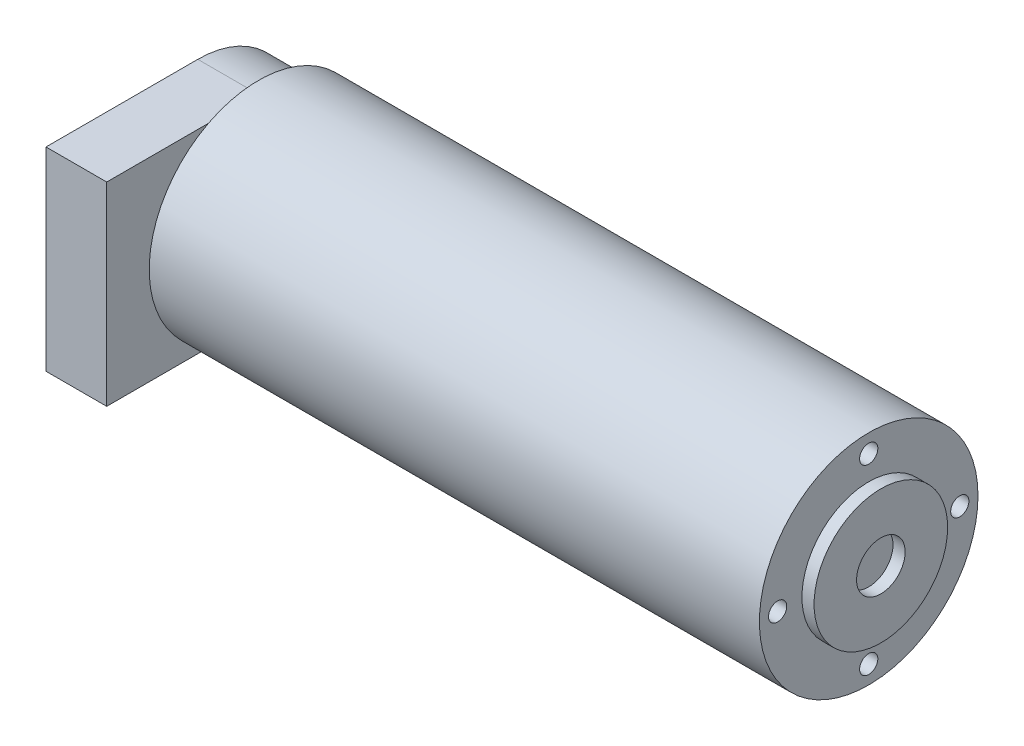
ISO-10303-21;
HEADER;
FILE_DESCRIPTION(('STEP AP214'),'2;1');
FILE_NAME('part.step','',(''),(''),'','','');
FILE_SCHEMA(('AUTOMOTIVE_DESIGN { 1 0 10303 214 1 1 1 1 }'));
ENDSEC;
DATA;
#1=APPLICATION_CONTEXT('core data for automotive mechanical design processes');
#2=APPLICATION_PROTOCOL_DEFINITION('international standard','automotive_design',2000,#1);
#3=PRODUCT_CONTEXT('',#1,'mechanical');
#4=PRODUCT('Part','Part','',(#3));
#5=PRODUCT_RELATED_PRODUCT_CATEGORY('part','',(#4));
#6=PRODUCT_DEFINITION_FORMATION('','',#4);
#7=PRODUCT_DEFINITION_CONTEXT('part definition',#1,'design');
#8=PRODUCT_DEFINITION('design','',#6,#7);
#9=PRODUCT_DEFINITION_SHAPE('','',#8);
#10=(LENGTH_UNIT() NAMED_UNIT(*) SI_UNIT(.MILLI.,.METRE.));
#11=(NAMED_UNIT(*) PLANE_ANGLE_UNIT() SI_UNIT($,.RADIAN.));
#12=(NAMED_UNIT(*) SI_UNIT($,.STERADIAN.) SOLID_ANGLE_UNIT());
#13=UNCERTAINTY_MEASURE_WITH_UNIT(LENGTH_MEASURE(1.E-05),#10,'distance_accuracy_value','');
#14=(GEOMETRIC_REPRESENTATION_CONTEXT(3) GLOBAL_UNCERTAINTY_ASSIGNED_CONTEXT((#13)) GLOBAL_UNIT_ASSIGNED_CONTEXT((#10,
#11,#12)) REPRESENTATION_CONTEXT('',''));
#15=CARTESIAN_POINT('',(0.,0.,0.));
#16=DIRECTION('',(0.,0.,1.));
#17=DIRECTION('',(1.,0.,0.));
#18=AXIS2_PLACEMENT_3D('',#15,#16,#17);
#19=CARTESIAN_POINT('',(-19.,0.,25.));
#20=DIRECTION('',(0.,0.,1.));
#21=DIRECTION('',(0.,-1.,0.));
#22=AXIS2_PLACEMENT_3D('',#19,#20,#21);
#23=PLANE('',#22);
#24=DIRECTION('',(0.,1.,0.));
#25=VECTOR('',#24,1.);
#26=CARTESIAN_POINT('',(0.,16.,25.));
#27=LINE('',#26,#25);
#28=CARTESIAN_POINT('',(0.,-16.,25.));
#29=VERTEX_POINT('',#28);
#30=CARTESIAN_POINT('',(0.,16.,25.));
#31=VERTEX_POINT('',#30);
#32=EDGE_CURVE('E111',#29,#31,#27,.T.);
#33=ORIENTED_EDGE('',*,*,#32,.F.);
#34=DIRECTION('',(1.,0.,0.));
#35=VECTOR('',#34,1.);
#36=CARTESIAN_POINT('',(-19.,-16.,25.));
#37=LINE('',#36,#35);
#38=CARTESIAN_POINT('',(10.,-16.,25.));
#39=VERTEX_POINT('',#38);
#40=EDGE_CURVE('E56',#29,#39,#37,.T.);
#41=ORIENTED_EDGE('',*,*,#40,.T.);
#42=DIRECTION('',(0.,1.,0.));
#43=VECTOR('',#42,1.);
#44=CARTESIAN_POINT('',(10.,0.,25.));
#45=LINE('',#44,#43);
#46=CARTESIAN_POINT('',(10.,16.,25.));
#47=VERTEX_POINT('',#46);
#48=EDGE_CURVE('E128',#39,#47,#45,.T.);
#49=ORIENTED_EDGE('',*,*,#48,.T.);
#50=DIRECTION('',(1.,0.,0.));
#51=VECTOR('',#50,1.);
#52=CARTESIAN_POINT('',(-19.,16.,25.));
#53=LINE('',#52,#51);
#54=EDGE_CURVE('E12',#31,#47,#53,.T.);
#55=ORIENTED_EDGE('',*,*,#54,.F.);
#56=EDGE_LOOP('',(#33,#41,#49,#55));
#57=FACE_BOUND('',#56,.T.);
#58=ADVANCED_FACE('F48',(#57),#23,.T.);
#59=CARTESIAN_POINT('',(10.,0.,0.));
#60=DIRECTION('',(-1.,0.,0.));
#61=DIRECTION('',(0.,0.,1.));
#62=AXIS2_PLACEMENT_3D('',#59,#60,#61);
#63=PLANE('',#62);
#64=CARTESIAN_POINT('',(10.,0.,0.));
#65=DIRECTION('',(-1.,0.,0.));
#66=DIRECTION('',(0.,0.,1.));
#67=AXIS2_PLACEMENT_3D('',#64,#65,#66);
#68=CIRCLE('',#67,18.);
#69=CARTESIAN_POINT('',(10.,-16.,8.24621125123531));
#70=VERTEX_POINT('',#69);
#71=CARTESIAN_POINT('',(10.,16.,8.24621125123531));
#72=VERTEX_POINT('',#71);
#73=EDGE_CURVE('E135',#70,#72,#68,.T.);
#74=ORIENTED_EDGE('',*,*,#73,.T.);
#75=DIRECTION('',(0.,0.,-1.));
#76=VECTOR('',#75,1.);
#77=CARTESIAN_POINT('',(10.,16.,0.));
#78=LINE('',#77,#76);
#79=EDGE_CURVE('E123',#47,#72,#78,.T.);
#80=ORIENTED_EDGE('',*,*,#79,.F.);
#81=ORIENTED_EDGE('',*,*,#48,.F.);
#82=DIRECTION('',(0.,0.,1.));
#83=VECTOR('',#82,1.);
#84=CARTESIAN_POINT('',(10.,-16.,0.));
#85=LINE('',#84,#83);
#86=EDGE_CURVE('E69',#70,#39,#85,.T.);
#87=ORIENTED_EDGE('',*,*,#86,.F.);
#88=EDGE_LOOP('',(#74,#80,#81,#87));
#89=FACE_BOUND('',#88,.T.);
#90=ADVANCED_FACE('F134',(#89),#63,.F.);
#91=CARTESIAN_POINT('',(0.,0.,0.));
#92=DIRECTION('',(1.,0.,0.));
#93=DIRECTION('',(0.,0.,-1.));
#94=AXIS2_PLACEMENT_3D('',#91,#92,#93);
#95=PLANE('',#94);
#96=DIRECTION('',(0.,0.,1.));
#97=VECTOR('',#96,1.);
#98=CARTESIAN_POINT('',(0.,16.,-18.));
#99=LINE('',#98,#97);
#100=CARTESIAN_POINT('',(0.,16.,0.));
#101=VERTEX_POINT('',#100);
#102=EDGE_CURVE('E109',#101,#31,#99,.T.);
#103=ORIENTED_EDGE('',*,*,#102,.F.);
#104=CARTESIAN_POINT('',(0.,0.,0.));
#105=DIRECTION('',(-1.,0.,0.));
#106=DIRECTION('',(0.,0.,1.));
#107=AXIS2_PLACEMENT_3D('',#104,#105,#106);
#108=CIRCLE('',#107,16.);
#109=CARTESIAN_POINT('',(0.,-16.,0.));
#110=VERTEX_POINT('',#109);
#111=EDGE_CURVE('E96',#101,#110,#108,.T.);
#112=ORIENTED_EDGE('',*,*,#111,.T.);
#113=DIRECTION('',(0.,0.,1.));
#114=VECTOR('',#113,1.);
#115=CARTESIAN_POINT('',(0.,-16.,-18.));
#116=LINE('',#115,#114);
#117=EDGE_CURVE('E112',#110,#29,#116,.T.);
#118=ORIENTED_EDGE('',*,*,#117,.T.);
#119=ORIENTED_EDGE('',*,*,#32,.T.);
#120=EDGE_LOOP('',(#103,#112,#118,#119));
#121=FACE_BOUND('',#120,.T.);
#122=ADVANCED_FACE('F50',(#121),#95,.F.);
#123=CARTESIAN_POINT('',(-19.,-16.,0.));
#124=DIRECTION('',(0.,1.,0.));
#125=DIRECTION('',(0.,0.,1.));
#126=AXIS2_PLACEMENT_3D('',#123,#124,#125);
#127=PLANE('',#126);
#128=ORIENTED_EDGE('',*,*,#40,.F.);
#129=ORIENTED_EDGE('',*,*,#117,.F.);
#130=DIRECTION('',(-1.,0.,0.));
#131=VECTOR('',#130,1.);
#132=CARTESIAN_POINT('',(10.,-16.,0.));
#133=LINE('',#132,#131);
#134=CARTESIAN_POINT('',(10.,-16.,0.));
#135=VERTEX_POINT('',#134);
#136=EDGE_CURVE('E104',#135,#110,#133,.T.);
#137=ORIENTED_EDGE('',*,*,#136,.F.);
#138=EDGE_CURVE('E126',#135,#70,#85,.T.);
#139=ORIENTED_EDGE('',*,*,#138,.T.);
#140=ORIENTED_EDGE('',*,*,#86,.T.);
#141=EDGE_LOOP('',(#128,#129,#137,#139,#140));
#142=FACE_BOUND('',#141,.T.);
#143=ADVANCED_FACE('F181',(#142),#127,.F.);
#144=CARTESIAN_POINT('',(-19.,16.,0.));
#145=DIRECTION('',(0.,1.,0.));
#146=DIRECTION('',(0.,0.,1.));
#147=AXIS2_PLACEMENT_3D('',#144,#145,#146);
#148=PLANE('',#147);
#149=ORIENTED_EDGE('',*,*,#102,.T.);
#150=ORIENTED_EDGE('',*,*,#54,.T.);
#151=ORIENTED_EDGE('',*,*,#79,.T.);
#152=DIRECTION('',(0.,0.,1.));
#153=VECTOR('',#152,1.);
#154=CARTESIAN_POINT('',(10.,16.,0.));
#155=LINE('',#154,#153);
#156=CARTESIAN_POINT('',(10.,16.,0.));
#157=VERTEX_POINT('',#156);
#158=EDGE_CURVE('E116',#157,#72,#155,.T.);
#159=ORIENTED_EDGE('',*,*,#158,.F.);
#160=DIRECTION('',(-1.,0.,0.));
#161=VECTOR('',#160,1.);
#162=CARTESIAN_POINT('',(10.,16.,0.));
#163=LINE('',#162,#161);
#164=EDGE_CURVE('E101',#157,#101,#163,.T.);
#165=ORIENTED_EDGE('',*,*,#164,.T.);
#166=EDGE_LOOP('',(#149,#150,#151,#159,#165));
#167=FACE_BOUND('',#166,.T.);
#168=ADVANCED_FACE('F115',(#167),#148,.T.);
#169=CARTESIAN_POINT('',(10.,0.,0.));
#170=DIRECTION('',(-1.,0.,0.));
#171=DIRECTION('',(0.,0.,1.));
#172=AXIS2_PLACEMENT_3D('',#169,#170,#171);
#173=PLANE('',#172);
#174=ORIENTED_EDGE('',*,*,#138,.F.);
#175=CARTESIAN_POINT('',(10.,0.,0.));
#176=DIRECTION('',(-1.,0.,0.));
#177=DIRECTION('',(0.,0.,1.));
#178=AXIS2_PLACEMENT_3D('',#175,#176,#177);
#179=CIRCLE('',#178,16.);
#180=EDGE_CURVE('E119',#157,#135,#179,.T.);
#181=ORIENTED_EDGE('',*,*,#180,.F.);
#182=ORIENTED_EDGE('',*,*,#158,.T.);
#183=EDGE_CURVE('E139',#72,#70,#68,.T.);
#184=ORIENTED_EDGE('',*,*,#183,.T.);
#185=EDGE_LOOP('',(#174,#181,#182,#184));
#186=FACE_BOUND('',#185,.T.);
#187=ADVANCED_FACE('F182',(#186),#173,.T.);
#188=CARTESIAN_POINT('',(110.5,0.,0.));
#189=DIRECTION('',(-1.,0.,0.));
#190=DIRECTION('',(0.,0.,1.));
#191=AXIS2_PLACEMENT_3D('',#188,#189,#190);
#192=CYLINDRICAL_SURFACE('',#191,18.);
#193=CARTESIAN_POINT('',(110.5,0.,0.));
#194=DIRECTION('',(1.,0.,0.));
#195=DIRECTION('',(0.,0.,-1.));
#196=AXIS2_PLACEMENT_3D('',#193,#194,#195);
#197=CIRCLE('',#196,18.);
#198=CARTESIAN_POINT('',(110.5,0.,-18.));
#199=VERTEX_POINT('',#198);
#200=EDGE_CURVE('E163',#199,#199,#197,.T.);
#201=ORIENTED_EDGE('',*,*,#200,.F.);
#202=EDGE_LOOP('',(#201));
#203=FACE_BOUND('',#202,.T.);
#204=ORIENTED_EDGE('',*,*,#183,.F.);
#205=ORIENTED_EDGE('',*,*,#73,.F.);
#206=EDGE_LOOP('',(#204,#205));
#207=FACE_BOUND('',#206,.T.);
#208=ADVANCED_FACE('F183',(#203,#207),#192,.T.);
#209=CARTESIAN_POINT('',(110.5,0.,0.));
#210=DIRECTION('',(1.,0.,0.));
#211=DIRECTION('',(0.,0.,-1.));
#212=AXIS2_PLACEMENT_3D('',#209,#210,#211);
#213=PLANE('',#212);
#214=CARTESIAN_POINT('',(110.5,-15.,-1.73472347597681E-13));
#215=DIRECTION('',(1.,0.,0.));
#216=DIRECTION('',(0.,0.,-1.));
#217=AXIS2_PLACEMENT_3D('',#214,#215,#216);
#218=CIRCLE('',#217,1.5);
#219=CARTESIAN_POINT('',(110.5,-15.,-1.50000000000018));
#220=VERTEX_POINT('',#219);
#221=EDGE_CURVE('E107',#220,#220,#218,.F.);
#222=ORIENTED_EDGE('',*,*,#221,.T.);
#223=EDGE_LOOP('',(#222));
#224=FACE_BOUND('',#223,.T.);
#225=CARTESIAN_POINT('',(110.5,-1.52655665885959E-13,15.));
#226=DIRECTION('',(1.,0.,0.));
#227=DIRECTION('',(0.,0.,-1.));
#228=AXIS2_PLACEMENT_3D('',#225,#226,#227);
#229=CIRCLE('',#228,1.50000000000001);
#230=CARTESIAN_POINT('',(110.5,-1.52655665885959E-13,13.5));
#231=VERTEX_POINT('',#230);
#232=EDGE_CURVE('E157',#231,#231,#229,.F.);
#233=ORIENTED_EDGE('',*,*,#232,.T.);
#234=EDGE_LOOP('',(#233));
#235=FACE_BOUND('',#234,.T.);
#236=CARTESIAN_POINT('',(110.5,0.,0.));
#237=DIRECTION('',(1.,0.,0.));
#238=DIRECTION('',(0.,0.,-1.));
#239=AXIS2_PLACEMENT_3D('',#236,#237,#238);
#240=CIRCLE('',#239,11.);
#241=CARTESIAN_POINT('',(110.5,0.,-11.));
#242=VERTEX_POINT('',#241);
#243=EDGE_CURVE('E175',#242,#242,#240,.T.);
#244=ORIENTED_EDGE('',*,*,#243,.F.);
#245=EDGE_LOOP('',(#244));
#246=FACE_BOUND('',#245,.T.);
#247=ORIENTED_EDGE('',*,*,#200,.T.);
#248=EDGE_LOOP('',(#247));
#249=FACE_BOUND('',#248,.T.);
#250=CARTESIAN_POINT('',(110.5,0.,-15.));
#251=DIRECTION('',(1.,0.,0.));
#252=DIRECTION('',(0.,0.,-1.));
#253=AXIS2_PLACEMENT_3D('',#250,#251,#252);
#254=CIRCLE('',#253,1.5);
#255=CARTESIAN_POINT('',(110.5,0.,-16.5));
#256=VERTEX_POINT('',#255);
#257=EDGE_CURVE('E149',#256,#256,#254,.T.);
#258=ORIENTED_EDGE('',*,*,#257,.F.);
#259=EDGE_LOOP('',(#258));
#260=FACE_BOUND('',#259,.T.);
#261=CARTESIAN_POINT('',(110.5,15.,0.));
#262=DIRECTION('',(1.,0.,0.));
#263=DIRECTION('',(0.,0.,-1.));
#264=AXIS2_PLACEMENT_3D('',#261,#262,#263);
#265=CIRCLE('',#264,1.5);
#266=CARTESIAN_POINT('',(110.5,15.,-1.5));
#267=VERTEX_POINT('',#266);
#268=EDGE_CURVE('E143',#267,#267,#265,.T.);
#269=ORIENTED_EDGE('',*,*,#268,.F.);
#270=EDGE_LOOP('',(#269));
#271=FACE_BOUND('',#270,.T.);
#272=ADVANCED_FACE('F185',(#224,#235,#246,#249,#260,#271),#213,.T.);
#273=CARTESIAN_POINT('',(112.5,0.,0.));
#274=DIRECTION('',(-1.,0.,0.));
#275=DIRECTION('',(0.,0.,1.));
#276=AXIS2_PLACEMENT_3D('',#273,#274,#275);
#277=CYLINDRICAL_SURFACE('',#276,11.);
#278=CARTESIAN_POINT('',(112.5,0.,0.));
#279=DIRECTION('',(1.,0.,0.));
#280=DIRECTION('',(0.,0.,-1.));
#281=AXIS2_PLACEMENT_3D('',#278,#279,#280);
#282=CIRCLE('',#281,11.);
#283=CARTESIAN_POINT('',(112.5,0.,-11.));
#284=VERTEX_POINT('',#283);
#285=EDGE_CURVE('E172',#284,#284,#282,.T.);
#286=ORIENTED_EDGE('',*,*,#285,.F.);
#287=EDGE_LOOP('',(#286));
#288=FACE_BOUND('',#287,.T.);
#289=ORIENTED_EDGE('',*,*,#243,.T.);
#290=EDGE_LOOP('',(#289));
#291=FACE_BOUND('',#290,.T.);
#292=ADVANCED_FACE('F192',(#288,#291),#277,.T.);
#293=CARTESIAN_POINT('',(112.5,0.,0.));
#294=DIRECTION('',(1.,0.,0.));
#295=DIRECTION('',(0.,0.,-1.));
#296=AXIS2_PLACEMENT_3D('',#293,#294,#295);
#297=PLANE('',#296);
#298=CARTESIAN_POINT('',(112.5,0.,0.));
#299=DIRECTION('',(1.,0.,0.));
#300=DIRECTION('',(0.,0.,-1.));
#301=AXIS2_PLACEMENT_3D('',#298,#299,#300);
#302=CIRCLE('',#301,4.);
#303=CARTESIAN_POINT('',(112.5,0.,-4.));
#304=VERTEX_POINT('',#303);
#305=EDGE_CURVE('E169',#304,#304,#302,.T.);
#306=ORIENTED_EDGE('',*,*,#305,.F.);
#307=EDGE_LOOP('',(#306));
#308=FACE_BOUND('',#307,.T.);
#309=ORIENTED_EDGE('',*,*,#285,.T.);
#310=EDGE_LOOP('',(#309));
#311=FACE_BOUND('',#310,.T.);
#312=ADVANCED_FACE('F247',(#308,#311),#297,.T.);
#313=CARTESIAN_POINT('',(110.5,0.,0.));
#314=DIRECTION('',(1.,0.,0.));
#315=DIRECTION('',(0.,0.,-1.));
#316=AXIS2_PLACEMENT_3D('',#313,#314,#315);
#317=CYLINDRICAL_SURFACE('',#316,4.);
#318=ORIENTED_EDGE('',*,*,#305,.T.);
#319=EDGE_LOOP('',(#318));
#320=FACE_BOUND('',#319,.T.);
#321=CARTESIAN_POINT('',(110.5,0.,0.));
#322=DIRECTION('',(1.,0.,0.));
#323=DIRECTION('',(0.,0.,-1.));
#324=AXIS2_PLACEMENT_3D('',#321,#322,#323);
#325=CIRCLE('',#324,4.);
#326=CARTESIAN_POINT('',(110.5,0.,-4.));
#327=VERTEX_POINT('',#326);
#328=EDGE_CURVE('E166',#327,#327,#325,.T.);
#329=ORIENTED_EDGE('',*,*,#328,.F.);
#330=EDGE_LOOP('',(#329));
#331=FACE_BOUND('',#330,.T.);
#332=ADVANCED_FACE('F243',(#320,#331),#317,.F.);
#333=CARTESIAN_POINT('',(110.5,0.,0.));
#334=DIRECTION('',(1.,0.,0.));
#335=DIRECTION('',(0.,0.,-1.));
#336=AXIS2_PLACEMENT_3D('',#333,#334,#335);
#337=PLANE('',#336);
#338=ORIENTED_EDGE('',*,*,#328,.T.);
#339=EDGE_LOOP('',(#338));
#340=FACE_BOUND('',#339,.T.);
#341=ADVANCED_FACE('F236',(#340),#337,.T.);
#342=CARTESIAN_POINT('',(102.5,-1.52655665885959E-13,15.));
#343=DIRECTION('',(1.,0.,0.));
#344=DIRECTION('',(0.,0.,-1.));
#345=AXIS2_PLACEMENT_3D('',#342,#343,#344);
#346=CYLINDRICAL_SURFACE('',#345,1.50000000000001);
#347=CARTESIAN_POINT('',(102.5,-1.52655665885959E-13,15.));
#348=DIRECTION('',(1.,0.,0.));
#349=DIRECTION('',(0.,0.,-1.));
#350=AXIS2_PLACEMENT_3D('',#347,#348,#349);
#351=CIRCLE('',#350,1.50000000000001);
#352=CARTESIAN_POINT('',(102.5,-1.52655665885959E-13,13.5));
#353=VERTEX_POINT('',#352);
#354=EDGE_CURVE('E160',#353,#353,#351,.F.);
#355=ORIENTED_EDGE('',*,*,#354,.T.);
#356=EDGE_LOOP('',(#355));
#357=FACE_BOUND('',#356,.T.);
#358=ORIENTED_EDGE('',*,*,#232,.F.);
#359=EDGE_LOOP('',(#358));
#360=FACE_BOUND('',#359,.T.);
#361=ADVANCED_FACE('F233',(#357,#360),#346,.F.);
#362=CARTESIAN_POINT('',(102.5,0.,0.));
#363=DIRECTION('',(1.,0.,0.));
#364=DIRECTION('',(0.,0.,-1.));
#365=AXIS2_PLACEMENT_3D('',#362,#363,#364);
#366=PLANE('',#365);
#367=ORIENTED_EDGE('',*,*,#354,.F.);
#368=EDGE_LOOP('',(#367));
#369=FACE_BOUND('',#368,.T.);
#370=ADVANCED_FACE('F228',(#369),#366,.T.);
#371=CARTESIAN_POINT('',(102.5,-15.,-1.73472347597681E-13));
#372=DIRECTION('',(1.,0.,0.));
#373=DIRECTION('',(0.,0.,-1.));
#374=AXIS2_PLACEMENT_3D('',#371,#372,#373);
#375=CYLINDRICAL_SURFACE('',#374,1.5);
#376=CARTESIAN_POINT('',(102.5,-15.,-1.73472347597681E-13));
#377=DIRECTION('',(1.,0.,0.));
#378=DIRECTION('',(0.,0.,-1.));
#379=AXIS2_PLACEMENT_3D('',#376,#377,#378);
#380=CIRCLE('',#379,1.5);
#381=CARTESIAN_POINT('',(102.5,-15.,-1.50000000000018));
#382=VERTEX_POINT('',#381);
#383=EDGE_CURVE('E152',#382,#382,#380,.F.);
#384=ORIENTED_EDGE('',*,*,#383,.T.);
#385=EDGE_LOOP('',(#384));
#386=FACE_BOUND('',#385,.T.);
#387=ORIENTED_EDGE('',*,*,#221,.F.);
#388=EDGE_LOOP('',(#387));
#389=FACE_BOUND('',#388,.T.);
#390=ADVANCED_FACE('F225',(#386,#389),#375,.F.);
#391=CARTESIAN_POINT('',(102.5,0.,0.));
#392=DIRECTION('',(1.,0.,0.));
#393=DIRECTION('',(0.,0.,-1.));
#394=AXIS2_PLACEMENT_3D('',#391,#392,#393);
#395=PLANE('',#394);
#396=ORIENTED_EDGE('',*,*,#383,.F.);
#397=EDGE_LOOP('',(#396));
#398=FACE_BOUND('',#397,.T.);
#399=ADVANCED_FACE('F220',(#398),#395,.T.);
#400=CARTESIAN_POINT('',(102.5,0.,-15.));
#401=DIRECTION('',(1.,0.,0.));
#402=DIRECTION('',(0.,0.,-1.));
#403=AXIS2_PLACEMENT_3D('',#400,#401,#402);
#404=CYLINDRICAL_SURFACE('',#403,1.5);
#405=CARTESIAN_POINT('',(102.5,0.,-15.));
#406=DIRECTION('',(1.,0.,0.));
#407=DIRECTION('',(0.,0.,-1.));
#408=AXIS2_PLACEMENT_3D('',#405,#406,#407);
#409=CIRCLE('',#408,1.5);
#410=CARTESIAN_POINT('',(102.5,0.,-16.5));
#411=VERTEX_POINT('',#410);
#412=EDGE_CURVE('E148',#411,#411,#409,.T.);
#413=ORIENTED_EDGE('',*,*,#412,.F.);
#414=EDGE_LOOP('',(#413));
#415=FACE_BOUND('',#414,.T.);
#416=ORIENTED_EDGE('',*,*,#257,.T.);
#417=EDGE_LOOP('',(#416));
#418=FACE_BOUND('',#417,.T.);
#419=ADVANCED_FACE('F217',(#415,#418),#404,.F.);
#420=CARTESIAN_POINT('',(102.5,0.,0.));
#421=DIRECTION('',(1.,0.,0.));
#422=DIRECTION('',(0.,0.,-1.));
#423=AXIS2_PLACEMENT_3D('',#420,#421,#422);
#424=PLANE('',#423);
#425=ORIENTED_EDGE('',*,*,#412,.T.);
#426=EDGE_LOOP('',(#425));
#427=FACE_BOUND('',#426,.T.);
#428=ADVANCED_FACE('F215',(#427),#424,.T.);
#429=CARTESIAN_POINT('',(102.5,15.,0.));
#430=DIRECTION('',(1.,0.,0.));
#431=DIRECTION('',(0.,0.,-1.));
#432=AXIS2_PLACEMENT_3D('',#429,#430,#431);
#433=CYLINDRICAL_SURFACE('',#432,1.5);
#434=CARTESIAN_POINT('',(102.5,15.,0.));
#435=DIRECTION('',(1.,0.,0.));
#436=DIRECTION('',(0.,0.,-1.));
#437=AXIS2_PLACEMENT_3D('',#434,#435,#436);
#438=CIRCLE('',#437,1.5);
#439=CARTESIAN_POINT('',(102.5,15.,-1.5));
#440=VERTEX_POINT('',#439);
#441=EDGE_CURVE('E140',#440,#440,#438,.T.);
#442=ORIENTED_EDGE('',*,*,#441,.F.);
#443=EDGE_LOOP('',(#442));
#444=FACE_BOUND('',#443,.T.);
#445=ORIENTED_EDGE('',*,*,#268,.T.);
#446=EDGE_LOOP('',(#445));
#447=FACE_BOUND('',#446,.T.);
#448=ADVANCED_FACE('F211',(#444,#447),#433,.F.);
#449=CARTESIAN_POINT('',(102.5,0.,0.));
#450=DIRECTION('',(1.,0.,0.));
#451=DIRECTION('',(0.,0.,-1.));
#452=AXIS2_PLACEMENT_3D('',#449,#450,#451);
#453=PLANE('',#452);
#454=ORIENTED_EDGE('',*,*,#441,.T.);
#455=EDGE_LOOP('',(#454));
#456=FACE_BOUND('',#455,.T.);
#457=ADVANCED_FACE('F208',(#456),#453,.T.);
#458=CARTESIAN_POINT('',(0.,0.,0.));
#459=DIRECTION('',(1.,0.,0.));
#460=DIRECTION('',(0.,0.,-1.));
#461=AXIS2_PLACEMENT_3D('',#458,#459,#460);
#462=CYLINDRICAL_SURFACE('',#461,16.);
#463=ORIENTED_EDGE('',*,*,#164,.F.);
#464=ORIENTED_EDGE('',*,*,#180,.T.);
#465=ORIENTED_EDGE('',*,*,#136,.T.);
#466=ORIENTED_EDGE('',*,*,#111,.F.);
#467=EDGE_LOOP('',(#463,#464,#465,#466));
#468=FACE_BOUND('',#467,.T.);
#469=ADVANCED_FACE('F98',(#468),#462,.T.);
#470=CLOSED_SHELL('',(#58,#90,#122,#143,#168,#187,#208,#272,#292,#312,#332,#341,#361,#370,#390,
#399,#419,#428,#448,#457,#469));
#471=MANIFOLD_SOLID_BREP('B2',#470);
#472=ADVANCED_BREP_SHAPE_REPRESENTATION('',(#18,#471),#14);
#473=SHAPE_DEFINITION_REPRESENTATION(#9,#472);
ENDSEC;
END-ISO-10303-21;
